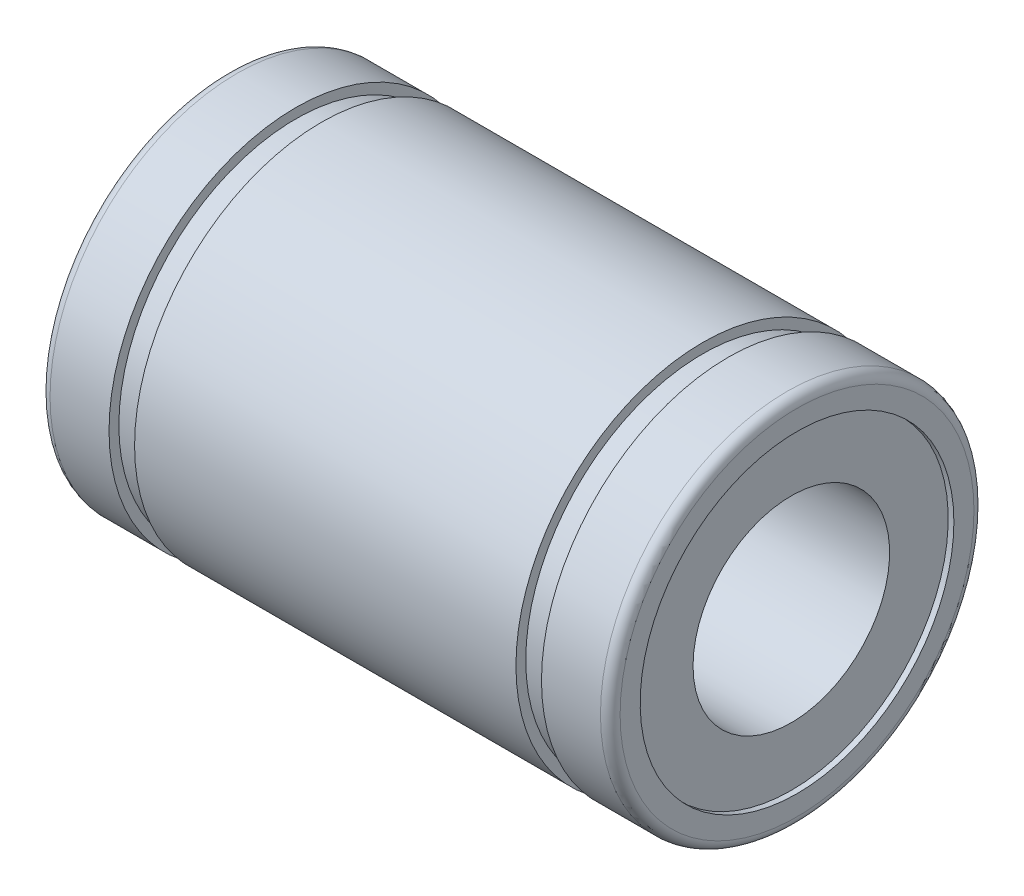
ISO-10303-21;
HEADER;
FILE_DESCRIPTION(('STEP AP214'),'2;1');
FILE_NAME('part.step','',(''),(''),'','','');
FILE_SCHEMA(('AUTOMOTIVE_DESIGN { 1 0 10303 214 1 1 1 1 }'));
ENDSEC;
DATA;
#1=APPLICATION_CONTEXT('core data for automotive mechanical design processes');
#2=APPLICATION_PROTOCOL_DEFINITION('international standard','automotive_design',2000,#1);
#3=PRODUCT_CONTEXT('',#1,'mechanical');
#4=PRODUCT('Part','Part','',(#3));
#5=PRODUCT_RELATED_PRODUCT_CATEGORY('part','',(#4));
#6=PRODUCT_DEFINITION_FORMATION('','',#4);
#7=PRODUCT_DEFINITION_CONTEXT('part definition',#1,'design');
#8=PRODUCT_DEFINITION('design','',#6,#7);
#9=PRODUCT_DEFINITION_SHAPE('','',#8);
#10=(LENGTH_UNIT() NAMED_UNIT(*) SI_UNIT(.MILLI.,.METRE.));
#11=(NAMED_UNIT(*) PLANE_ANGLE_UNIT() SI_UNIT($,.RADIAN.));
#12=(NAMED_UNIT(*) SI_UNIT($,.STERADIAN.) SOLID_ANGLE_UNIT());
#13=UNCERTAINTY_MEASURE_WITH_UNIT(LENGTH_MEASURE(1.E-05),#10,'distance_accuracy_value','');
#14=(GEOMETRIC_REPRESENTATION_CONTEXT(3) GLOBAL_UNCERTAINTY_ASSIGNED_CONTEXT((#13)) GLOBAL_UNIT_ASSIGNED_CONTEXT((#10,
#11,#12)) REPRESENTATION_CONTEXT('',''));
#15=CARTESIAN_POINT('',(0.,0.,0.));
#16=DIRECTION('',(0.,0.,1.));
#17=DIRECTION('',(1.,0.,0.));
#18=AXIS2_PLACEMENT_3D('',#15,#16,#17);
#19=CARTESIAN_POINT('',(-14.,0.,0.));
#20=DIRECTION('',(-1.,0.,0.));
#21=DIRECTION('',(0.,0.,-1.));
#22=AXIS2_PLACEMENT_3D('',#19,#20,#21);
#23=TOROIDAL_SURFACE('',#22,9.,0.5);
#24=CARTESIAN_POINT('',(-14.5,0.,0.));
#25=DIRECTION('',(1.,0.,0.));
#26=DIRECTION('',(0.,0.,-1.));
#27=AXIS2_PLACEMENT_3D('',#24,#25,#26);
#28=CIRCLE('',#27,9.);
#29=CARTESIAN_POINT('',(-14.5,0.,-9.));
#30=VERTEX_POINT('',#29);
#31=EDGE_CURVE('E10',#30,#30,#28,.T.);
#32=ORIENTED_EDGE('',*,*,#31,.T.);
#33=EDGE_LOOP('',(#32));
#34=FACE_BOUND('',#33,.T.);
#35=CARTESIAN_POINT('',(-14.,0.,0.));
#36=DIRECTION('',(1.,0.,0.));
#37=DIRECTION('',(0.,0.,-1.));
#38=AXIS2_PLACEMENT_3D('',#35,#36,#37);
#39=CIRCLE('',#38,9.5);
#40=CARTESIAN_POINT('',(-14.,0.,-9.5));
#41=VERTEX_POINT('',#40);
#42=EDGE_CURVE('E60',#41,#41,#39,.T.);
#43=ORIENTED_EDGE('',*,*,#42,.F.);
#44=EDGE_LOOP('',(#43));
#45=FACE_BOUND('',#44,.T.);
#46=ADVANCED_FACE('F36',(#34,#45),#23,.T.);
#47=CARTESIAN_POINT('',(-14.5,9.,0.));
#48=DIRECTION('',(1.,0.,0.));
#49=DIRECTION('',(0.,0.,1.));
#50=AXIS2_PLACEMENT_3D('',#47,#48,#49);
#51=PLANE('',#50);
#52=CARTESIAN_POINT('',(-14.5,0.,0.));
#53=DIRECTION('',(-1.,0.,0.));
#54=DIRECTION('',(0.,0.,1.));
#55=AXIS2_PLACEMENT_3D('',#52,#53,#54);
#56=CIRCLE('',#55,7.98);
#57=CARTESIAN_POINT('',(-14.5,0.,7.98));
#58=VERTEX_POINT('',#57);
#59=EDGE_CURVE('E61',#58,#58,#56,.T.);
#60=ORIENTED_EDGE('',*,*,#59,.F.);
#61=EDGE_LOOP('',(#60));
#62=FACE_BOUND('',#61,.T.);
#63=ORIENTED_EDGE('',*,*,#31,.F.);
#64=EDGE_LOOP('',(#63));
#65=FACE_BOUND('',#64,.T.);
#66=ADVANCED_FACE('F137',(#62,#65),#51,.F.);
#67=CARTESIAN_POINT('',(14.5,0.,0.));
#68=DIRECTION('',(-1.,0.,0.));
#69=DIRECTION('',(0.,0.,-1.));
#70=AXIS2_PLACEMENT_3D('',#67,#68,#69);
#71=PLANE('',#70);
#72=CARTESIAN_POINT('',(14.5,0.,0.));
#73=DIRECTION('',(1.,0.,0.));
#74=DIRECTION('',(0.,0.,-1.));
#75=AXIS2_PLACEMENT_3D('',#72,#73,#74);
#76=CIRCLE('',#75,7.98);
#77=CARTESIAN_POINT('',(14.5,0.,-7.98));
#78=VERTEX_POINT('',#77);
#79=EDGE_CURVE('E57',#78,#78,#76,.T.);
#80=ORIENTED_EDGE('',*,*,#79,.F.);
#81=EDGE_LOOP('',(#80));
#82=FACE_BOUND('',#81,.T.);
#83=CARTESIAN_POINT('',(14.5,0.,0.));
#84=DIRECTION('',(1.,0.,0.));
#85=DIRECTION('',(0.,0.,-1.));
#86=AXIS2_PLACEMENT_3D('',#83,#84,#85);
#87=CIRCLE('',#86,9.);
#88=CARTESIAN_POINT('',(14.5,0.,-9.));
#89=VERTEX_POINT('',#88);
#90=EDGE_CURVE('E44',#89,#89,#87,.T.);
#91=ORIENTED_EDGE('',*,*,#90,.T.);
#92=EDGE_LOOP('',(#91));
#93=FACE_BOUND('',#92,.T.);
#94=ADVANCED_FACE('F134',(#82,#93),#71,.F.);
#95=CARTESIAN_POINT('',(14.,0.,0.));
#96=DIRECTION('',(-1.,0.,0.));
#97=DIRECTION('',(0.,0.,-1.));
#98=AXIS2_PLACEMENT_3D('',#95,#96,#97);
#99=TOROIDAL_SURFACE('',#98,9.,0.5);
#100=CARTESIAN_POINT('',(14.,0.,0.));
#101=DIRECTION('',(1.,0.,0.));
#102=DIRECTION('',(0.,0.,-1.));
#103=AXIS2_PLACEMENT_3D('',#100,#101,#102);
#104=CIRCLE('',#103,9.5);
#105=CARTESIAN_POINT('',(14.,0.,-9.5));
#106=VERTEX_POINT('',#105);
#107=EDGE_CURVE('E53',#106,#106,#104,.T.);
#108=ORIENTED_EDGE('',*,*,#107,.T.);
#109=EDGE_LOOP('',(#108));
#110=FACE_BOUND('',#109,.T.);
#111=ORIENTED_EDGE('',*,*,#90,.F.);
#112=EDGE_LOOP('',(#111));
#113=FACE_BOUND('',#112,.T.);
#114=ADVANCED_FACE('F119',(#110,#113),#99,.T.);
#115=CARTESIAN_POINT('',(0.,0.,0.));
#116=DIRECTION('',(-1.,0.,0.));
#117=DIRECTION('',(0.,0.,-1.));
#118=AXIS2_PLACEMENT_3D('',#115,#116,#117);
#119=CYLINDRICAL_SURFACE('',#118,9.5);
#120=CARTESIAN_POINT('',(11.,0.,0.));
#121=DIRECTION('',(1.,0.,0.));
#122=DIRECTION('',(0.,0.,-1.));
#123=AXIS2_PLACEMENT_3D('',#120,#121,#122);
#124=CIRCLE('',#123,9.5);
#125=CARTESIAN_POINT('',(11.,0.,-9.5));
#126=VERTEX_POINT('',#125);
#127=EDGE_CURVE('E111',#126,#126,#124,.T.);
#128=ORIENTED_EDGE('',*,*,#127,.T.);
#129=EDGE_LOOP('',(#128));
#130=FACE_BOUND('',#129,.T.);
#131=ORIENTED_EDGE('',*,*,#107,.F.);
#132=EDGE_LOOP('',(#131));
#133=FACE_BOUND('',#132,.T.);
#134=ADVANCED_FACE('F122',(#130,#133),#119,.T.);
#135=CARTESIAN_POINT('',(11.,9.,0.));
#136=DIRECTION('',(-1.,0.,0.));
#137=DIRECTION('',(0.,0.,-1.));
#138=AXIS2_PLACEMENT_3D('',#135,#136,#137);
#139=PLANE('',#138);
#140=ORIENTED_EDGE('',*,*,#127,.F.);
#141=EDGE_LOOP('',(#140));
#142=FACE_BOUND('',#141,.T.);
#143=CARTESIAN_POINT('',(11.,0.,0.));
#144=DIRECTION('',(1.,0.,0.));
#145=DIRECTION('',(0.,0.,-1.));
#146=AXIS2_PLACEMENT_3D('',#143,#144,#145);
#147=CIRCLE('',#146,9.);
#148=CARTESIAN_POINT('',(11.,0.,-9.));
#149=VERTEX_POINT('',#148);
#150=EDGE_CURVE('E107',#149,#149,#147,.T.);
#151=ORIENTED_EDGE('',*,*,#150,.T.);
#152=EDGE_LOOP('',(#151));
#153=FACE_BOUND('',#152,.T.);
#154=ADVANCED_FACE('F124',(#142,#153),#139,.T.);
#155=CARTESIAN_POINT('',(0.,0.,0.));
#156=DIRECTION('',(-1.,0.,0.));
#157=DIRECTION('',(0.,0.,-1.));
#158=AXIS2_PLACEMENT_3D('',#155,#156,#157);
#159=CYLINDRICAL_SURFACE('',#158,9.);
#160=ORIENTED_EDGE('',*,*,#150,.F.);
#161=EDGE_LOOP('',(#160));
#162=FACE_BOUND('',#161,.T.);
#163=CARTESIAN_POINT('',(9.7,0.,0.));
#164=DIRECTION('',(1.,0.,0.));
#165=DIRECTION('',(0.,0.,-1.));
#166=AXIS2_PLACEMENT_3D('',#163,#164,#165);
#167=CIRCLE('',#166,9.);
#168=CARTESIAN_POINT('',(9.7,0.,-9.));
#169=VERTEX_POINT('',#168);
#170=EDGE_CURVE('E103',#169,#169,#167,.T.);
#171=ORIENTED_EDGE('',*,*,#170,.T.);
#172=EDGE_LOOP('',(#171));
#173=FACE_BOUND('',#172,.T.);
#174=ADVANCED_FACE('F131',(#162,#173),#159,.T.);
#175=CARTESIAN_POINT('',(9.7,9.5,0.));
#176=DIRECTION('',(1.,0.,0.));
#177=DIRECTION('',(0.,0.,1.));
#178=AXIS2_PLACEMENT_3D('',#175,#176,#177);
#179=PLANE('',#178);
#180=ORIENTED_EDGE('',*,*,#170,.F.);
#181=EDGE_LOOP('',(#180));
#182=FACE_BOUND('',#181,.T.);
#183=CARTESIAN_POINT('',(9.7,0.,0.));
#184=DIRECTION('',(1.,0.,0.));
#185=DIRECTION('',(0.,0.,-1.));
#186=AXIS2_PLACEMENT_3D('',#183,#184,#185);
#187=CIRCLE('',#186,9.5);
#188=CARTESIAN_POINT('',(9.7,0.,-9.5));
#189=VERTEX_POINT('',#188);
#190=EDGE_CURVE('E99',#189,#189,#187,.T.);
#191=ORIENTED_EDGE('',*,*,#190,.T.);
#192=EDGE_LOOP('',(#191));
#193=FACE_BOUND('',#192,.T.);
#194=ADVANCED_FACE('F172',(#182,#193),#179,.T.);
#195=CARTESIAN_POINT('',(0.,0.,0.));
#196=DIRECTION('',(-1.,0.,0.));
#197=DIRECTION('',(0.,0.,-1.));
#198=AXIS2_PLACEMENT_3D('',#195,#196,#197);
#199=CYLINDRICAL_SURFACE('',#198,9.5);
#200=CARTESIAN_POINT('',(-9.7,0.,0.));
#201=DIRECTION('',(1.,0.,0.));
#202=DIRECTION('',(0.,0.,-1.));
#203=AXIS2_PLACEMENT_3D('',#200,#201,#202);
#204=CIRCLE('',#203,9.5);
#205=CARTESIAN_POINT('',(-9.7,0.,-9.5));
#206=VERTEX_POINT('',#205);
#207=EDGE_CURVE('E95',#206,#206,#204,.T.);
#208=ORIENTED_EDGE('',*,*,#207,.T.);
#209=EDGE_LOOP('',(#208));
#210=FACE_BOUND('',#209,.T.);
#211=ORIENTED_EDGE('',*,*,#190,.F.);
#212=EDGE_LOOP('',(#211));
#213=FACE_BOUND('',#212,.T.);
#214=ADVANCED_FACE('F168',(#210,#213),#199,.T.);
#215=CARTESIAN_POINT('',(-9.7,9.,0.));
#216=DIRECTION('',(-1.,0.,0.));
#217=DIRECTION('',(0.,0.,-1.));
#218=AXIS2_PLACEMENT_3D('',#215,#216,#217);
#219=PLANE('',#218);
#220=ORIENTED_EDGE('',*,*,#207,.F.);
#221=EDGE_LOOP('',(#220));
#222=FACE_BOUND('',#221,.T.);
#223=CARTESIAN_POINT('',(-9.7,0.,0.));
#224=DIRECTION('',(1.,0.,0.));
#225=DIRECTION('',(0.,0.,-1.));
#226=AXIS2_PLACEMENT_3D('',#223,#224,#225);
#227=CIRCLE('',#226,9.);
#228=CARTESIAN_POINT('',(-9.7,0.,-9.));
#229=VERTEX_POINT('',#228);
#230=EDGE_CURVE('E91',#229,#229,#227,.T.);
#231=ORIENTED_EDGE('',*,*,#230,.T.);
#232=EDGE_LOOP('',(#231));
#233=FACE_BOUND('',#232,.T.);
#234=ADVANCED_FACE('F160',(#222,#233),#219,.T.);
#235=CARTESIAN_POINT('',(0.,0.,0.));
#236=DIRECTION('',(-1.,0.,0.));
#237=DIRECTION('',(0.,0.,-1.));
#238=AXIS2_PLACEMENT_3D('',#235,#236,#237);
#239=CYLINDRICAL_SURFACE('',#238,9.);
#240=ORIENTED_EDGE('',*,*,#230,.F.);
#241=EDGE_LOOP('',(#240));
#242=FACE_BOUND('',#241,.T.);
#243=CARTESIAN_POINT('',(-11.,0.,0.));
#244=DIRECTION('',(1.,0.,0.));
#245=DIRECTION('',(0.,0.,-1.));
#246=AXIS2_PLACEMENT_3D('',#243,#244,#245);
#247=CIRCLE('',#246,9.);
#248=CARTESIAN_POINT('',(-11.,0.,-9.));
#249=VERTEX_POINT('',#248);
#250=EDGE_CURVE('E87',#249,#249,#247,.T.);
#251=ORIENTED_EDGE('',*,*,#250,.T.);
#252=EDGE_LOOP('',(#251));
#253=FACE_BOUND('',#252,.T.);
#254=ADVANCED_FACE('F154',(#242,#253),#239,.T.);
#255=CARTESIAN_POINT('',(-11.,9.5,0.));
#256=DIRECTION('',(1.,0.,0.));
#257=DIRECTION('',(0.,0.,1.));
#258=AXIS2_PLACEMENT_3D('',#255,#256,#257);
#259=PLANE('',#258);
#260=ORIENTED_EDGE('',*,*,#250,.F.);
#261=EDGE_LOOP('',(#260));
#262=FACE_BOUND('',#261,.T.);
#263=CARTESIAN_POINT('',(-11.,0.,0.));
#264=DIRECTION('',(1.,0.,0.));
#265=DIRECTION('',(0.,0.,-1.));
#266=AXIS2_PLACEMENT_3D('',#263,#264,#265);
#267=CIRCLE('',#266,9.5);
#268=CARTESIAN_POINT('',(-11.,0.,-9.5));
#269=VERTEX_POINT('',#268);
#270=EDGE_CURVE('E84',#269,#269,#267,.T.);
#271=ORIENTED_EDGE('',*,*,#270,.T.);
#272=EDGE_LOOP('',(#271));
#273=FACE_BOUND('',#272,.T.);
#274=ADVANCED_FACE('F149',(#262,#273),#259,.T.);
#275=CARTESIAN_POINT('',(0.,0.,0.));
#276=DIRECTION('',(-1.,0.,0.));
#277=DIRECTION('',(0.,0.,-1.));
#278=AXIS2_PLACEMENT_3D('',#275,#276,#277);
#279=CYLINDRICAL_SURFACE('',#278,9.5);
#280=ORIENTED_EDGE('',*,*,#42,.T.);
#281=EDGE_LOOP('',(#280));
#282=FACE_BOUND('',#281,.T.);
#283=ORIENTED_EDGE('',*,*,#270,.F.);
#284=EDGE_LOOP('',(#283));
#285=FACE_BOUND('',#284,.T.);
#286=ADVANCED_FACE('F145',(#282,#285),#279,.T.);
#287=CARTESIAN_POINT('',(13.05,0.,0.));
#288=DIRECTION('',(1.,0.,0.));
#289=DIRECTION('',(0.,-1.,0.));
#290=AXIS2_PLACEMENT_3D('',#287,#288,#289);
#291=CYLINDRICAL_SURFACE('',#290,7.98);
#292=CARTESIAN_POINT('',(14.21,0.,0.));
#293=DIRECTION('',(1.,0.,0.));
#294=DIRECTION('',(0.,-1.,0.));
#295=AXIS2_PLACEMENT_3D('',#292,#293,#294);
#296=CIRCLE('',#295,7.98);
#297=CARTESIAN_POINT('',(14.21,-7.98,0.));
#298=VERTEX_POINT('',#297);
#299=EDGE_CURVE('E64',#298,#298,#296,.T.);
#300=ORIENTED_EDGE('',*,*,#299,.F.);
#301=EDGE_LOOP('',(#300));
#302=FACE_BOUND('',#301,.T.);
#303=ORIENTED_EDGE('',*,*,#79,.T.);
#304=EDGE_LOOP('',(#303));
#305=FACE_BOUND('',#304,.T.);
#306=ADVANCED_FACE('F148',(#302,#305),#291,.F.);
#307=CARTESIAN_POINT('',(-13.05,0.,0.));
#308=DIRECTION('',(-1.,0.,0.));
#309=DIRECTION('',(0.,-1.,0.));
#310=AXIS2_PLACEMENT_3D('',#307,#308,#309);
#311=CYLINDRICAL_SURFACE('',#310,7.98);
#312=CARTESIAN_POINT('',(-14.21,0.,0.));
#313=DIRECTION('',(-1.,0.,0.));
#314=DIRECTION('',(0.,-1.,0.));
#315=AXIS2_PLACEMENT_3D('',#312,#313,#314);
#316=CIRCLE('',#315,7.98);
#317=CARTESIAN_POINT('',(-14.21,-7.98,0.));
#318=VERTEX_POINT('',#317);
#319=EDGE_CURVE('E70',#318,#318,#316,.T.);
#320=ORIENTED_EDGE('',*,*,#319,.F.);
#321=EDGE_LOOP('',(#320));
#322=FACE_BOUND('',#321,.T.);
#323=ORIENTED_EDGE('',*,*,#59,.T.);
#324=EDGE_LOOP('',(#323));
#325=FACE_BOUND('',#324,.T.);
#326=ADVANCED_FACE('F303',(#322,#325),#311,.F.);
#327=CARTESIAN_POINT('',(14.21,0.,0.));
#328=DIRECTION('',(1.,0.,0.));
#329=DIRECTION('',(0.,0.,1.));
#330=AXIS2_PLACEMENT_3D('',#327,#328,#329);
#331=PLANE('',#330);
#332=CARTESIAN_POINT('',(14.21,0.,0.));
#333=DIRECTION('',(-1.,0.,0.));
#334=DIRECTION('',(0.,0.,1.));
#335=AXIS2_PLACEMENT_3D('',#332,#333,#334);
#336=CIRCLE('',#335,5.);
#337=CARTESIAN_POINT('',(14.21,0.,5.));
#338=VERTEX_POINT('',#337);
#339=EDGE_CURVE('E78',#338,#338,#336,.T.);
#340=ORIENTED_EDGE('',*,*,#339,.T.);
#341=EDGE_LOOP('',(#340));
#342=FACE_BOUND('',#341,.T.);
#343=ORIENTED_EDGE('',*,*,#299,.T.);
#344=EDGE_LOOP('',(#343));
#345=FACE_BOUND('',#344,.T.);
#346=ADVANCED_FACE('F313',(#342,#345),#331,.T.);
#347=CARTESIAN_POINT('',(-14.21,0.,0.));
#348=DIRECTION('',(-1.,0.,0.));
#349=DIRECTION('',(0.,0.,-1.));
#350=AXIS2_PLACEMENT_3D('',#347,#348,#349);
#351=PLANE('',#350);
#352=CARTESIAN_POINT('',(-14.21,0.,0.));
#353=DIRECTION('',(1.,0.,0.));
#354=DIRECTION('',(0.,0.,-1.));
#355=AXIS2_PLACEMENT_3D('',#352,#353,#354);
#356=CIRCLE('',#355,5.);
#357=CARTESIAN_POINT('',(-14.21,0.,-5.));
#358=VERTEX_POINT('',#357);
#359=EDGE_CURVE('E39',#358,#358,#356,.T.);
#360=ORIENTED_EDGE('',*,*,#359,.T.);
#361=EDGE_LOOP('',(#360));
#362=FACE_BOUND('',#361,.T.);
#363=ORIENTED_EDGE('',*,*,#319,.T.);
#364=EDGE_LOOP('',(#363));
#365=FACE_BOUND('',#364,.T.);
#366=ADVANCED_FACE('F325',(#362,#365),#351,.T.);
#367=CARTESIAN_POINT('',(-29.,0.,0.));
#368=DIRECTION('',(1.,0.,0.));
#369=DIRECTION('',(0.,-1.,0.));
#370=AXIS2_PLACEMENT_3D('',#367,#368,#369);
#371=CYLINDRICAL_SURFACE('',#370,5.);
#372=ORIENTED_EDGE('',*,*,#339,.F.);
#373=EDGE_LOOP('',(#372));
#374=FACE_BOUND('',#373,.T.);
#375=ORIENTED_EDGE('',*,*,#359,.F.);
#376=EDGE_LOOP('',(#375));
#377=FACE_BOUND('',#376,.T.);
#378=ADVANCED_FACE('F336',(#374,#377),#371,.F.);
#379=CLOSED_SHELL('',(#46,#66,#94,#114,#134,#154,#174,#194,#214,#234,#254,#274,#286,#306,#326,
#346,#366,#378));
#380=MANIFOLD_SOLID_BREP('B2',#379);
#381=ADVANCED_BREP_SHAPE_REPRESENTATION('',(#18,#380),#14);
#382=SHAPE_DEFINITION_REPRESENTATION(#9,#381);
ENDSEC;
END-ISO-10303-21;
